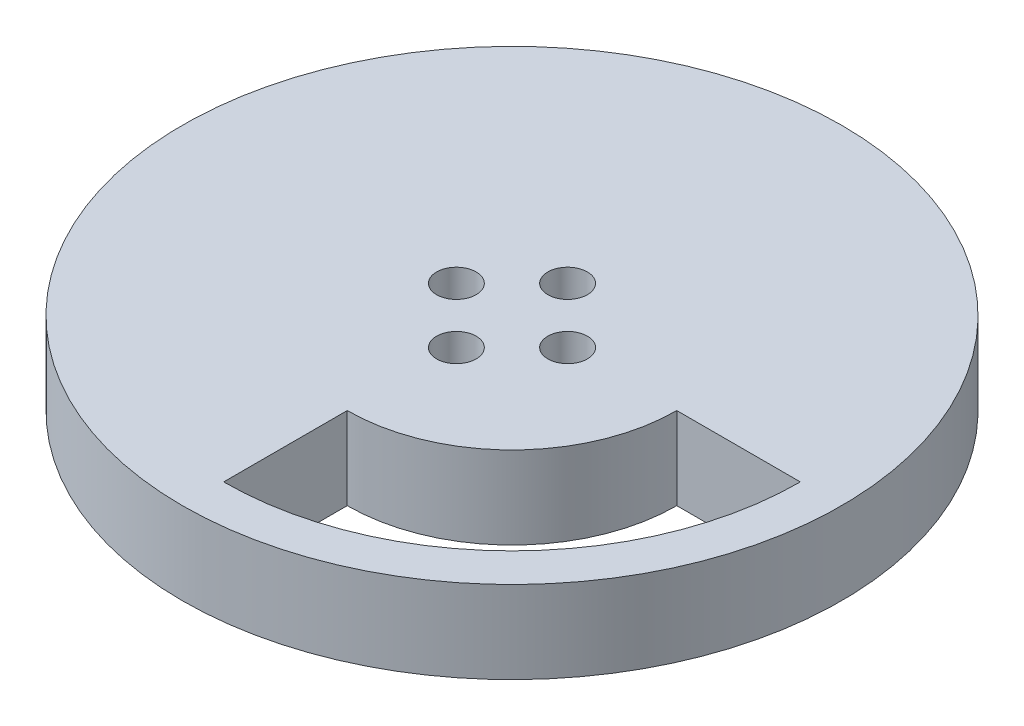
ISO-10303-21;
HEADER;
FILE_DESCRIPTION(('STEP AP214'),'2;1');
FILE_NAME('part.step','',(''),(''),'','','');
FILE_SCHEMA(('AUTOMOTIVE_DESIGN { 1 0 10303 214 1 1 1 1 }'));
ENDSEC;
DATA;
#1=APPLICATION_CONTEXT('core data for automotive mechanical design processes');
#2=APPLICATION_PROTOCOL_DEFINITION('international standard','automotive_design',2000,#1);
#3=PRODUCT_CONTEXT('',#1,'mechanical');
#4=PRODUCT('Part','Part','',(#3));
#5=PRODUCT_RELATED_PRODUCT_CATEGORY('part','',(#4));
#6=PRODUCT_DEFINITION_FORMATION('','',#4);
#7=PRODUCT_DEFINITION_CONTEXT('part definition',#1,'design');
#8=PRODUCT_DEFINITION('design','',#6,#7);
#9=PRODUCT_DEFINITION_SHAPE('','',#8);
#10=(LENGTH_UNIT() NAMED_UNIT(*) SI_UNIT(.MILLI.,.METRE.));
#11=(NAMED_UNIT(*) PLANE_ANGLE_UNIT() SI_UNIT($,.RADIAN.));
#12=(NAMED_UNIT(*) SI_UNIT($,.STERADIAN.) SOLID_ANGLE_UNIT());
#13=UNCERTAINTY_MEASURE_WITH_UNIT(LENGTH_MEASURE(1.E-05),#10,'distance_accuracy_value','');
#14=(GEOMETRIC_REPRESENTATION_CONTEXT(3) GLOBAL_UNCERTAINTY_ASSIGNED_CONTEXT((#13)) GLOBAL_UNIT_ASSIGNED_CONTEXT((#10,
#11,#12)) REPRESENTATION_CONTEXT('',''));
#15=CARTESIAN_POINT('',(0.,0.,0.));
#16=DIRECTION('',(0.,0.,1.));
#17=DIRECTION('',(1.,0.,0.));
#18=AXIS2_PLACEMENT_3D('',#15,#16,#17);
#19=CARTESIAN_POINT('',(6.75,10.,0.));
#20=DIRECTION('',(0.,-1.,0.));
#21=DIRECTION('',(0.,0.,-1.));
#22=AXIS2_PLACEMENT_3D('',#19,#20,#21);
#23=CYLINDRICAL_SURFACE('',#22,1.25);
#24=CARTESIAN_POINT('',(6.75,0.,0.));
#25=DIRECTION('',(0.,1.,0.));
#26=DIRECTION('',(0.,0.,1.));
#27=AXIS2_PLACEMENT_3D('',#24,#25,#26);
#28=CIRCLE('',#27,1.25);
#29=CARTESIAN_POINT('',(6.75,0.,1.25));
#30=VERTEX_POINT('',#29);
#31=EDGE_CURVE('E176',#30,#30,#28,.T.);
#32=ORIENTED_EDGE('',*,*,#31,.F.);
#33=EDGE_LOOP('',(#32));
#34=FACE_BOUND('',#33,.T.);
#35=CARTESIAN_POINT('',(6.75,4.,0.));
#36=DIRECTION('',(0.,1.,0.));
#37=DIRECTION('',(0.,0.,1.));
#38=AXIS2_PLACEMENT_3D('',#35,#36,#37);
#39=CIRCLE('',#38,1.25);
#40=CARTESIAN_POINT('',(6.75,4.,1.25));
#41=VERTEX_POINT('',#40);
#42=EDGE_CURVE('E43',#41,#41,#39,.T.);
#43=ORIENTED_EDGE('',*,*,#42,.T.);
#44=EDGE_LOOP('',(#43));
#45=FACE_BOUND('',#44,.T.);
#46=ADVANCED_FACE('F39',(#34,#45),#23,.F.);
#47=CARTESIAN_POINT('',(0.,10.,6.75));
#48=DIRECTION('',(0.,-1.,0.));
#49=DIRECTION('',(0.,0.,-1.));
#50=AXIS2_PLACEMENT_3D('',#47,#48,#49);
#51=CYLINDRICAL_SURFACE('',#50,1.25);
#52=CARTESIAN_POINT('',(0.,0.,6.75));
#53=DIRECTION('',(0.,1.,0.));
#54=DIRECTION('',(0.,0.,1.));
#55=AXIS2_PLACEMENT_3D('',#52,#53,#54);
#56=CIRCLE('',#55,1.25);
#57=CARTESIAN_POINT('',(0.,0.,8.));
#58=VERTEX_POINT('',#57);
#59=EDGE_CURVE('E172',#58,#58,#56,.T.);
#60=ORIENTED_EDGE('',*,*,#59,.F.);
#61=EDGE_LOOP('',(#60));
#62=FACE_BOUND('',#61,.T.);
#63=CARTESIAN_POINT('',(0.,4.,6.75));
#64=DIRECTION('',(0.,1.,0.));
#65=DIRECTION('',(0.,0.,1.));
#66=AXIS2_PLACEMENT_3D('',#63,#64,#65);
#67=CIRCLE('',#66,1.25);
#68=CARTESIAN_POINT('',(0.,4.,8.));
#69=VERTEX_POINT('',#68);
#70=EDGE_CURVE('E189',#69,#69,#67,.T.);
#71=ORIENTED_EDGE('',*,*,#70,.T.);
#72=EDGE_LOOP('',(#71));
#73=FACE_BOUND('',#72,.T.);
#74=ADVANCED_FACE('F259',(#62,#73),#51,.F.);
#75=CARTESIAN_POINT('',(-6.75,10.,0.));
#76=DIRECTION('',(0.,-1.,0.));
#77=DIRECTION('',(0.,0.,-1.));
#78=AXIS2_PLACEMENT_3D('',#75,#76,#77);
#79=CYLINDRICAL_SURFACE('',#78,1.25);
#80=CARTESIAN_POINT('',(-6.75,0.,0.));
#81=DIRECTION('',(0.,1.,0.));
#82=DIRECTION('',(0.,0.,1.));
#83=AXIS2_PLACEMENT_3D('',#80,#81,#82);
#84=CIRCLE('',#83,1.25);
#85=CARTESIAN_POINT('',(-6.75,0.,1.24999999999995));
#86=VERTEX_POINT('',#85);
#87=EDGE_CURVE('E168',#86,#86,#84,.T.);
#88=ORIENTED_EDGE('',*,*,#87,.F.);
#89=EDGE_LOOP('',(#88));
#90=FACE_BOUND('',#89,.T.);
#91=CARTESIAN_POINT('',(-6.75,4.,0.));
#92=DIRECTION('',(0.,1.,0.));
#93=DIRECTION('',(0.,0.,1.));
#94=AXIS2_PLACEMENT_3D('',#91,#92,#93);
#95=CIRCLE('',#94,1.25);
#96=CARTESIAN_POINT('',(-6.75,4.,1.24999999999995));
#97=VERTEX_POINT('',#96);
#98=EDGE_CURVE('E186',#97,#97,#95,.T.);
#99=ORIENTED_EDGE('',*,*,#98,.T.);
#100=EDGE_LOOP('',(#99));
#101=FACE_BOUND('',#100,.T.);
#102=ADVANCED_FACE('F240',(#90,#101),#79,.F.);
#103=CARTESIAN_POINT('',(0.,10.,-6.75));
#104=DIRECTION('',(0.,-1.,0.));
#105=DIRECTION('',(0.,0.,-1.));
#106=AXIS2_PLACEMENT_3D('',#103,#104,#105);
#107=CYLINDRICAL_SURFACE('',#106,1.25);
#108=CARTESIAN_POINT('',(0.,0.,-6.75));
#109=DIRECTION('',(0.,1.,0.));
#110=DIRECTION('',(0.,0.,1.));
#111=AXIS2_PLACEMENT_3D('',#108,#109,#110);
#112=CIRCLE('',#111,1.25);
#113=CARTESIAN_POINT('',(0.,0.,-5.5));
#114=VERTEX_POINT('',#113);
#115=EDGE_CURVE('E164',#114,#114,#112,.T.);
#116=ORIENTED_EDGE('',*,*,#115,.F.);
#117=EDGE_LOOP('',(#116));
#118=FACE_BOUND('',#117,.T.);
#119=CARTESIAN_POINT('',(0.,4.,-6.75));
#120=DIRECTION('',(0.,1.,0.));
#121=DIRECTION('',(0.,0.,1.));
#122=AXIS2_PLACEMENT_3D('',#119,#120,#121);
#123=CIRCLE('',#122,1.25);
#124=CARTESIAN_POINT('',(0.,4.,-5.5));
#125=VERTEX_POINT('',#124);
#126=EDGE_CURVE('E136',#125,#125,#123,.T.);
#127=ORIENTED_EDGE('',*,*,#126,.T.);
#128=EDGE_LOOP('',(#127));
#129=FACE_BOUND('',#128,.T.);
#130=ADVANCED_FACE('F215',(#118,#129),#107,.F.);
#131=CARTESIAN_POINT('',(0.,10.,0.));
#132=DIRECTION('',(0.,1.,0.));
#133=DIRECTION('',(0.,0.,1.));
#134=AXIS2_PLACEMENT_3D('',#131,#132,#133);
#135=PLANE('',#134);
#136=CARTESIAN_POINT('',(0.,10.,0.));
#137=DIRECTION('',(0.,-1.,0.));
#138=DIRECTION('',(0.,0.,1.));
#139=AXIS2_PLACEMENT_3D('',#136,#137,#138);
#140=CIRCLE('',#139,20.);
#141=CARTESIAN_POINT('',(20.,10.,0.));
#142=VERTEX_POINT('',#141);
#143=CARTESIAN_POINT('',(0.,10.,20.));
#144=VERTEX_POINT('',#143);
#145=EDGE_CURVE('E57',#142,#144,#140,.T.);
#146=ORIENTED_EDGE('',*,*,#145,.F.);
#147=DIRECTION('',(-1.,0.,0.));
#148=VECTOR('',#147,1.);
#149=CARTESIAN_POINT('',(20.,10.,0.));
#150=LINE('',#149,#148);
#151=CARTESIAN_POINT('',(35.,10.,0.));
#152=VERTEX_POINT('',#151);
#153=EDGE_CURVE('E104',#152,#142,#150,.T.);
#154=ORIENTED_EDGE('',*,*,#153,.F.);
#155=CARTESIAN_POINT('',(0.,10.,0.));
#156=DIRECTION('',(0.,1.,0.));
#157=DIRECTION('',(0.,0.,1.));
#158=AXIS2_PLACEMENT_3D('',#155,#156,#157);
#159=CIRCLE('',#158,35.);
#160=CARTESIAN_POINT('',(0.,10.,35.));
#161=VERTEX_POINT('',#160);
#162=EDGE_CURVE('E108',#161,#152,#159,.T.);
#163=ORIENTED_EDGE('',*,*,#162,.F.);
#164=DIRECTION('',(0.,0.,1.));
#165=VECTOR('',#164,1.);
#166=CARTESIAN_POINT('',(0.,10.,20.));
#167=LINE('',#166,#165);
#168=EDGE_CURVE('E117',#144,#161,#167,.T.);
#169=ORIENTED_EDGE('',*,*,#168,.F.);
#170=EDGE_LOOP('',(#146,#154,#163,#169));
#171=FACE_BOUND('',#170,.T.);
#172=CARTESIAN_POINT('',(0.,10.,-6.75));
#173=DIRECTION('',(0.,1.,0.));
#174=DIRECTION('',(0.,0.,1.));
#175=AXIS2_PLACEMENT_3D('',#172,#173,#174);
#176=CIRCLE('',#175,2.4);
#177=CARTESIAN_POINT('',(0.,10.,-4.35));
#178=VERTEX_POINT('',#177);
#179=EDGE_CURVE('E137',#178,#178,#176,.T.);
#180=ORIENTED_EDGE('',*,*,#179,.F.);
#181=EDGE_LOOP('',(#180));
#182=FACE_BOUND('',#181,.T.);
#183=CARTESIAN_POINT('',(6.75000000000019,10.,-1.1866413177538E-13));
#184=DIRECTION('',(0.,1.,0.));
#185=DIRECTION('',(0.,0.,1.));
#186=AXIS2_PLACEMENT_3D('',#183,#184,#185);
#187=CIRCLE('',#186,2.40000000000015);
#188=CARTESIAN_POINT('',(6.75000000000019,10.,2.40000000000003));
#189=VERTEX_POINT('',#188);
#190=EDGE_CURVE('E145',#189,#189,#187,.T.);
#191=ORIENTED_EDGE('',*,*,#190,.F.);
#192=EDGE_LOOP('',(#191));
#193=FACE_BOUND('',#192,.T.);
#194=CARTESIAN_POINT('',(3.08082672696035E-13,10.,6.75));
#195=DIRECTION('',(0.,1.,0.));
#196=DIRECTION('',(0.,0.,1.));
#197=AXIS2_PLACEMENT_3D('',#194,#195,#196);
#198=CIRCLE('',#197,2.40000000000041);
#199=CARTESIAN_POINT('',(3.08082672696035E-13,10.,9.15000000000041));
#200=VERTEX_POINT('',#199);
#201=EDGE_CURVE('E153',#200,#200,#198,.T.);
#202=ORIENTED_EDGE('',*,*,#201,.F.);
#203=EDGE_LOOP('',(#202));
#204=FACE_BOUND('',#203,.T.);
#205=CARTESIAN_POINT('',(-6.74999999999981,10.,1.19490768364805E-13));
#206=DIRECTION('',(0.,1.,0.));
#207=DIRECTION('',(0.,0.,1.));
#208=AXIS2_PLACEMENT_3D('',#205,#206,#207);
#209=CIRCLE('',#208,2.4000000000003);
#210=CARTESIAN_POINT('',(-6.74999999999981,10.,2.40000000000042));
#211=VERTEX_POINT('',#210);
#212=EDGE_CURVE('E126',#211,#211,#209,.T.);
#213=ORIENTED_EDGE('',*,*,#212,.F.);
#214=EDGE_LOOP('',(#213));
#215=FACE_BOUND('',#214,.T.);
#216=CARTESIAN_POINT('',(0.,10.,0.));
#217=DIRECTION('',(0.,1.,0.));
#218=DIRECTION('',(0.,0.,1.));
#219=AXIS2_PLACEMENT_3D('',#216,#217,#218);
#220=CIRCLE('',#219,40.);
#221=CARTESIAN_POINT('',(0.,10.,40.));
#222=VERTEX_POINT('',#221);
#223=EDGE_CURVE('E11',#222,#222,#220,.T.);
#224=ORIENTED_EDGE('',*,*,#223,.T.);
#225=EDGE_LOOP('',(#224));
#226=FACE_BOUND('',#225,.T.);
#227=ADVANCED_FACE('F212',(#171,#182,#193,#204,#215,#226),#135,.T.);
#228=CARTESIAN_POINT('',(0.,0.,0.));
#229=DIRECTION('',(0.,1.,0.));
#230=DIRECTION('',(0.,0.,1.));
#231=AXIS2_PLACEMENT_3D('',#228,#229,#230);
#232=PLANE('',#231);
#233=DIRECTION('',(-1.,0.,0.));
#234=VECTOR('',#233,1.);
#235=CARTESIAN_POINT('',(20.,0.,0.));
#236=LINE('',#235,#234);
#237=CARTESIAN_POINT('',(35.,0.,0.));
#238=VERTEX_POINT('',#237);
#239=CARTESIAN_POINT('',(20.,0.,0.));
#240=VERTEX_POINT('',#239);
#241=EDGE_CURVE('E92',#238,#240,#236,.T.);
#242=ORIENTED_EDGE('',*,*,#241,.T.);
#243=CARTESIAN_POINT('',(0.,0.,0.));
#244=DIRECTION('',(0.,-1.,0.));
#245=DIRECTION('',(0.,0.,1.));
#246=AXIS2_PLACEMENT_3D('',#243,#244,#245);
#247=CIRCLE('',#246,20.);
#248=CARTESIAN_POINT('',(0.,0.,20.));
#249=VERTEX_POINT('',#248);
#250=EDGE_CURVE('E85',#240,#249,#247,.T.);
#251=ORIENTED_EDGE('',*,*,#250,.T.);
#252=DIRECTION('',(0.,0.,1.));
#253=VECTOR('',#252,1.);
#254=CARTESIAN_POINT('',(0.,0.,20.));
#255=LINE('',#254,#253);
#256=CARTESIAN_POINT('',(0.,0.,35.));
#257=VERTEX_POINT('',#256);
#258=EDGE_CURVE('E95',#249,#257,#255,.T.);
#259=ORIENTED_EDGE('',*,*,#258,.T.);
#260=CARTESIAN_POINT('',(0.,0.,0.));
#261=DIRECTION('',(0.,1.,0.));
#262=DIRECTION('',(0.,0.,1.));
#263=AXIS2_PLACEMENT_3D('',#260,#261,#262);
#264=CIRCLE('',#263,35.);
#265=EDGE_CURVE('E65',#257,#238,#264,.T.);
#266=ORIENTED_EDGE('',*,*,#265,.T.);
#267=EDGE_LOOP('',(#242,#251,#259,#266));
#268=FACE_BOUND('',#267,.T.);
#269=CARTESIAN_POINT('',(0.,0.,0.));
#270=DIRECTION('',(0.,1.,0.));
#271=DIRECTION('',(0.,0.,1.));
#272=AXIS2_PLACEMENT_3D('',#269,#270,#271);
#273=CIRCLE('',#272,40.);
#274=CARTESIAN_POINT('',(0.,0.,40.));
#275=VERTEX_POINT('',#274);
#276=EDGE_CURVE('E49',#275,#275,#273,.T.);
#277=ORIENTED_EDGE('',*,*,#276,.F.);
#278=EDGE_LOOP('',(#277));
#279=FACE_BOUND('',#278,.T.);
#280=ORIENTED_EDGE('',*,*,#31,.T.);
#281=EDGE_LOOP('',(#280));
#282=FACE_BOUND('',#281,.T.);
#283=ORIENTED_EDGE('',*,*,#59,.T.);
#284=EDGE_LOOP('',(#283));
#285=FACE_BOUND('',#284,.T.);
#286=ORIENTED_EDGE('',*,*,#87,.T.);
#287=EDGE_LOOP('',(#286));
#288=FACE_BOUND('',#287,.T.);
#289=ORIENTED_EDGE('',*,*,#115,.T.);
#290=EDGE_LOOP('',(#289));
#291=FACE_BOUND('',#290,.T.);
#292=ADVANCED_FACE('F100',(#268,#279,#282,#285,#288,#291),#232,.F.);
#293=CARTESIAN_POINT('',(0.,10.,0.));
#294=DIRECTION('',(0.,-1.,0.));
#295=DIRECTION('',(0.,0.,-1.));
#296=AXIS2_PLACEMENT_3D('',#293,#294,#295);
#297=CYLINDRICAL_SURFACE('',#296,40.);
#298=ORIENTED_EDGE('',*,*,#223,.F.);
#299=EDGE_LOOP('',(#298));
#300=FACE_BOUND('',#299,.T.);
#301=ORIENTED_EDGE('',*,*,#276,.T.);
#302=EDGE_LOOP('',(#301));
#303=FACE_BOUND('',#302,.T.);
#304=ADVANCED_FACE('F41',(#300,#303),#297,.T.);
#305=CARTESIAN_POINT('',(0.,4.,-6.75));
#306=DIRECTION('',(0.,1.,0.));
#307=DIRECTION('',(0.,0.,1.));
#308=AXIS2_PLACEMENT_3D('',#305,#306,#307);
#309=CYLINDRICAL_SURFACE('',#308,2.4);
#310=CARTESIAN_POINT('',(0.,4.,-6.75));
#311=DIRECTION('',(0.,1.,0.));
#312=DIRECTION('',(0.,0.,1.));
#313=AXIS2_PLACEMENT_3D('',#310,#311,#312);
#314=CIRCLE('',#313,2.4);
#315=CARTESIAN_POINT('',(0.,4.,-4.35));
#316=VERTEX_POINT('',#315);
#317=EDGE_CURVE('E132',#316,#316,#314,.T.);
#318=ORIENTED_EDGE('',*,*,#317,.F.);
#319=EDGE_LOOP('',(#318));
#320=FACE_BOUND('',#319,.T.);
#321=ORIENTED_EDGE('',*,*,#179,.T.);
#322=EDGE_LOOP('',(#321));
#323=FACE_BOUND('',#322,.T.);
#324=ADVANCED_FACE('F226',(#320,#323),#309,.F.);
#325=CARTESIAN_POINT('',(0.,4.,-6.75));
#326=DIRECTION('',(0.,1.,0.));
#327=DIRECTION('',(0.,0.,1.));
#328=AXIS2_PLACEMENT_3D('',#325,#326,#327);
#329=PLANE('',#328);
#330=ORIENTED_EDGE('',*,*,#126,.F.);
#331=EDGE_LOOP('',(#330));
#332=FACE_BOUND('',#331,.T.);
#333=ORIENTED_EDGE('',*,*,#317,.T.);
#334=EDGE_LOOP('',(#333));
#335=FACE_BOUND('',#334,.T.);
#336=ADVANCED_FACE('F244',(#332,#335),#329,.T.);
#337=CARTESIAN_POINT('',(-6.74999999999981,4.,1.19490768364805E-13));
#338=DIRECTION('',(0.,1.,0.));
#339=DIRECTION('',(0.,0.,1.));
#340=AXIS2_PLACEMENT_3D('',#337,#338,#339);
#341=CYLINDRICAL_SURFACE('',#340,2.4000000000003);
#342=CARTESIAN_POINT('',(-6.74999999999981,4.,1.19490768364805E-13));
#343=DIRECTION('',(0.,1.,0.));
#344=DIRECTION('',(0.,0.,1.));
#345=AXIS2_PLACEMENT_3D('',#342,#343,#344);
#346=CIRCLE('',#345,2.4000000000003);
#347=CARTESIAN_POINT('',(-6.74999999999981,4.,2.40000000000042));
#348=VERTEX_POINT('',#347);
#349=EDGE_CURVE('E157',#348,#348,#346,.T.);
#350=ORIENTED_EDGE('',*,*,#349,.F.);
#351=EDGE_LOOP('',(#350));
#352=FACE_BOUND('',#351,.T.);
#353=ORIENTED_EDGE('',*,*,#212,.T.);
#354=EDGE_LOOP('',(#353));
#355=FACE_BOUND('',#354,.T.);
#356=ADVANCED_FACE('F247',(#352,#355),#341,.F.);
#357=CARTESIAN_POINT('',(-6.74999999999981,4.,1.19490768364805E-13));
#358=DIRECTION('',(0.,1.,0.));
#359=DIRECTION('',(0.,0.,1.));
#360=AXIS2_PLACEMENT_3D('',#357,#358,#359);
#361=PLANE('',#360);
#362=ORIENTED_EDGE('',*,*,#98,.F.);
#363=EDGE_LOOP('',(#362));
#364=FACE_BOUND('',#363,.T.);
#365=ORIENTED_EDGE('',*,*,#349,.T.);
#366=EDGE_LOOP('',(#365));
#367=FACE_BOUND('',#366,.T.);
#368=ADVANCED_FACE('F273',(#364,#367),#361,.T.);
#369=CARTESIAN_POINT('',(3.08082672696035E-13,4.,6.75));
#370=DIRECTION('',(0.,1.,0.));
#371=DIRECTION('',(0.,0.,1.));
#372=AXIS2_PLACEMENT_3D('',#369,#370,#371);
#373=CYLINDRICAL_SURFACE('',#372,2.40000000000041);
#374=CARTESIAN_POINT('',(3.08082672696035E-13,4.,6.75));
#375=DIRECTION('',(0.,1.,0.));
#376=DIRECTION('',(0.,0.,1.));
#377=AXIS2_PLACEMENT_3D('',#374,#375,#376);
#378=CIRCLE('',#377,2.40000000000041);
#379=CARTESIAN_POINT('',(3.08082672696035E-13,4.,9.15000000000041));
#380=VERTEX_POINT('',#379);
#381=EDGE_CURVE('E149',#380,#380,#378,.T.);
#382=ORIENTED_EDGE('',*,*,#381,.F.);
#383=EDGE_LOOP('',(#382));
#384=FACE_BOUND('',#383,.T.);
#385=ORIENTED_EDGE('',*,*,#201,.T.);
#386=EDGE_LOOP('',(#385));
#387=FACE_BOUND('',#386,.T.);
#388=ADVANCED_FACE('F277',(#384,#387),#373,.F.);
#389=CARTESIAN_POINT('',(3.08082672696035E-13,4.,6.75));
#390=DIRECTION('',(0.,1.,0.));
#391=DIRECTION('',(0.,0.,1.));
#392=AXIS2_PLACEMENT_3D('',#389,#390,#391);
#393=PLANE('',#392);
#394=ORIENTED_EDGE('',*,*,#70,.F.);
#395=EDGE_LOOP('',(#394));
#396=FACE_BOUND('',#395,.T.);
#397=ORIENTED_EDGE('',*,*,#381,.T.);
#398=EDGE_LOOP('',(#397));
#399=FACE_BOUND('',#398,.T.);
#400=ADVANCED_FACE('F208',(#396,#399),#393,.T.);
#401=CARTESIAN_POINT('',(6.75000000000019,4.,-1.1866413177538E-13));
#402=DIRECTION('',(0.,1.,0.));
#403=DIRECTION('',(0.,0.,1.));
#404=AXIS2_PLACEMENT_3D('',#401,#402,#403);
#405=CYLINDRICAL_SURFACE('',#404,2.40000000000015);
#406=CARTESIAN_POINT('',(6.75000000000019,4.,-1.1866413177538E-13));
#407=DIRECTION('',(0.,1.,0.));
#408=DIRECTION('',(0.,0.,1.));
#409=AXIS2_PLACEMENT_3D('',#406,#407,#408);
#410=CIRCLE('',#409,2.40000000000015);
#411=CARTESIAN_POINT('',(6.75000000000019,4.,2.40000000000003));
#412=VERTEX_POINT('',#411);
#413=EDGE_CURVE('E141',#412,#412,#410,.T.);
#414=ORIENTED_EDGE('',*,*,#413,.F.);
#415=EDGE_LOOP('',(#414));
#416=FACE_BOUND('',#415,.T.);
#417=ORIENTED_EDGE('',*,*,#190,.T.);
#418=EDGE_LOOP('',(#417));
#419=FACE_BOUND('',#418,.T.);
#420=ADVANCED_FACE('F202',(#416,#419),#405,.F.);
#421=CARTESIAN_POINT('',(6.75000000000019,4.,-1.1866413177538E-13));
#422=DIRECTION('',(0.,1.,0.));
#423=DIRECTION('',(0.,0.,1.));
#424=AXIS2_PLACEMENT_3D('',#421,#422,#423);
#425=PLANE('',#424);
#426=ORIENTED_EDGE('',*,*,#42,.F.);
#427=EDGE_LOOP('',(#426));
#428=FACE_BOUND('',#427,.T.);
#429=ORIENTED_EDGE('',*,*,#413,.T.);
#430=EDGE_LOOP('',(#429));
#431=FACE_BOUND('',#430,.T.);
#432=ADVANCED_FACE('F199',(#428,#431),#425,.T.);
#433=CARTESIAN_POINT('',(0.,0.,0.));
#434=DIRECTION('',(0.,1.,0.));
#435=DIRECTION('',(0.,0.,1.));
#436=AXIS2_PLACEMENT_3D('',#433,#434,#435);
#437=CYLINDRICAL_SURFACE('',#436,20.);
#438=ORIENTED_EDGE('',*,*,#145,.T.);
#439=DIRECTION('',(0.,1.,0.));
#440=VECTOR('',#439,1.);
#441=CARTESIAN_POINT('',(0.,0.,20.));
#442=LINE('',#441,#440);
#443=EDGE_CURVE('E81',#249,#144,#442,.T.);
#444=ORIENTED_EDGE('',*,*,#443,.F.);
#445=ORIENTED_EDGE('',*,*,#250,.F.);
#446=DIRECTION('',(0.,1.,0.));
#447=VECTOR('',#446,1.);
#448=CARTESIAN_POINT('',(20.,0.,0.));
#449=LINE('',#448,#447);
#450=EDGE_CURVE('E123',#240,#142,#449,.T.);
#451=ORIENTED_EDGE('',*,*,#450,.T.);
#452=EDGE_LOOP('',(#438,#444,#445,#451));
#453=FACE_BOUND('',#452,.T.);
#454=ADVANCED_FACE('F83',(#453),#437,.T.);
#455=CARTESIAN_POINT('',(20.,0.,0.));
#456=DIRECTION('',(0.,0.,-1.));
#457=DIRECTION('',(-1.,0.,0.));
#458=AXIS2_PLACEMENT_3D('',#455,#456,#457);
#459=PLANE('',#458);
#460=ORIENTED_EDGE('',*,*,#153,.T.);
#461=ORIENTED_EDGE('',*,*,#450,.F.);
#462=ORIENTED_EDGE('',*,*,#241,.F.);
#463=DIRECTION('',(0.,1.,0.));
#464=VECTOR('',#463,1.);
#465=CARTESIAN_POINT('',(35.,0.,0.));
#466=LINE('',#465,#464);
#467=EDGE_CURVE('E127',#238,#152,#466,.T.);
#468=ORIENTED_EDGE('',*,*,#467,.T.);
#469=EDGE_LOOP('',(#460,#461,#462,#468));
#470=FACE_BOUND('',#469,.T.);
#471=ADVANCED_FACE('F306',(#470),#459,.F.);
#472=CARTESIAN_POINT('',(0.,0.,0.));
#473=DIRECTION('',(0.,1.,0.));
#474=DIRECTION('',(0.,0.,1.));
#475=AXIS2_PLACEMENT_3D('',#472,#473,#474);
#476=CYLINDRICAL_SURFACE('',#475,35.);
#477=ORIENTED_EDGE('',*,*,#162,.T.);
#478=ORIENTED_EDGE('',*,*,#467,.F.);
#479=ORIENTED_EDGE('',*,*,#265,.F.);
#480=DIRECTION('',(0.,1.,0.));
#481=VECTOR('',#480,1.);
#482=CARTESIAN_POINT('',(0.,0.,35.));
#483=LINE('',#482,#481);
#484=EDGE_CURVE('E91',#257,#161,#483,.T.);
#485=ORIENTED_EDGE('',*,*,#484,.T.);
#486=EDGE_LOOP('',(#477,#478,#479,#485));
#487=FACE_BOUND('',#486,.T.);
#488=ADVANCED_FACE('F314',(#487),#476,.F.);
#489=CARTESIAN_POINT('',(0.,0.,20.));
#490=DIRECTION('',(-1.,0.,0.));
#491=DIRECTION('',(0.,0.,1.));
#492=AXIS2_PLACEMENT_3D('',#489,#490,#491);
#493=PLANE('',#492);
#494=ORIENTED_EDGE('',*,*,#168,.T.);
#495=ORIENTED_EDGE('',*,*,#484,.F.);
#496=ORIENTED_EDGE('',*,*,#258,.F.);
#497=ORIENTED_EDGE('',*,*,#443,.T.);
#498=EDGE_LOOP('',(#494,#495,#496,#497));
#499=FACE_BOUND('',#498,.T.);
#500=ADVANCED_FACE('F96',(#499),#493,.F.);
#501=CLOSED_SHELL('',(#46,#74,#102,#130,#227,#292,#304,#324,#336,#356,#368,#388,#400,#420,#432,
#454,#471,#488,#500));
#502=MANIFOLD_SOLID_BREP('B2',#501);
#503=ADVANCED_BREP_SHAPE_REPRESENTATION('',(#18,#502),#14);
#504=SHAPE_DEFINITION_REPRESENTATION(#9,#503);
ENDSEC;
END-ISO-10303-21;
